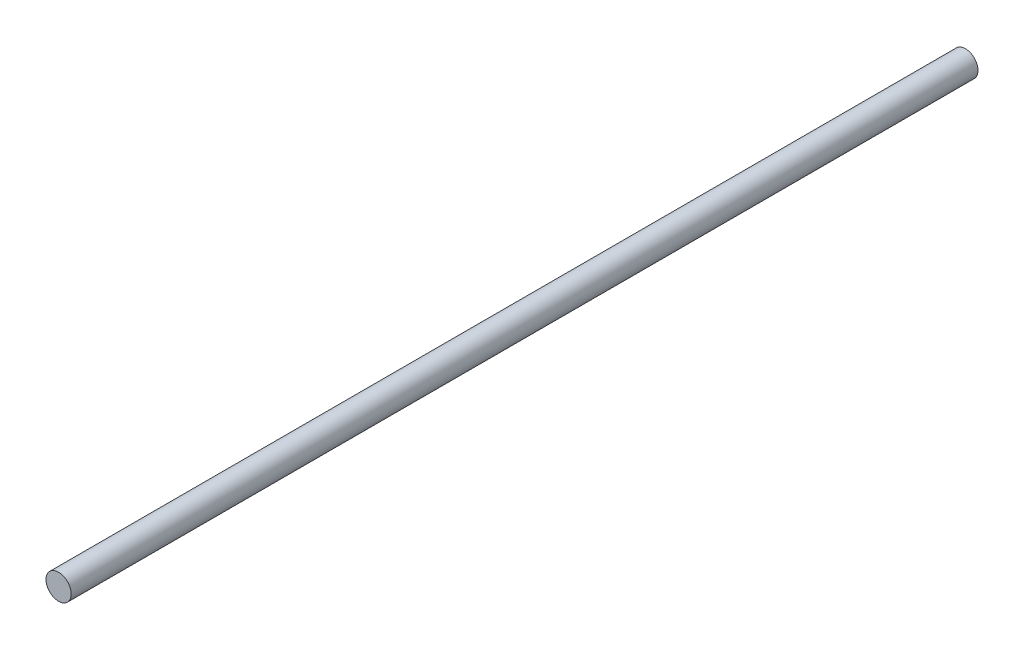
ISO-10303-21;
HEADER;
FILE_DESCRIPTION(('STEP AP214'),'2;1');
FILE_NAME('part.step','',(''),(''),'','','');
FILE_SCHEMA(('AUTOMOTIVE_DESIGN { 1 0 10303 214 1 1 1 1 }'));
ENDSEC;
DATA;
#1=APPLICATION_CONTEXT('core data for automotive mechanical design processes');
#2=APPLICATION_PROTOCOL_DEFINITION('international standard','automotive_design',2000,#1);
#3=PRODUCT_CONTEXT('',#1,'mechanical');
#4=PRODUCT('Part','Part','',(#3));
#5=PRODUCT_RELATED_PRODUCT_CATEGORY('part','',(#4));
#6=PRODUCT_DEFINITION_FORMATION('','',#4);
#7=PRODUCT_DEFINITION_CONTEXT('part definition',#1,'design');
#8=PRODUCT_DEFINITION('design','',#6,#7);
#9=PRODUCT_DEFINITION_SHAPE('','',#8);
#10=(LENGTH_UNIT() NAMED_UNIT(*) SI_UNIT(.MILLI.,.METRE.));
#11=(NAMED_UNIT(*) PLANE_ANGLE_UNIT() SI_UNIT($,.RADIAN.));
#12=(NAMED_UNIT(*) SI_UNIT($,.STERADIAN.) SOLID_ANGLE_UNIT());
#13=UNCERTAINTY_MEASURE_WITH_UNIT(LENGTH_MEASURE(1.E-05),#10,'distance_accuracy_value','');
#14=(GEOMETRIC_REPRESENTATION_CONTEXT(3) GLOBAL_UNCERTAINTY_ASSIGNED_CONTEXT((#13)) GLOBAL_UNIT_ASSIGNED_CONTEXT((#10,
#11,#12)) REPRESENTATION_CONTEXT('',''));
#15=CARTESIAN_POINT('',(0.,0.,0.));
#16=DIRECTION('',(0.,0.,1.));
#17=DIRECTION('',(1.,0.,0.));
#18=AXIS2_PLACEMENT_3D('',#15,#16,#17);
#19=CARTESIAN_POINT('',(0.,0.,-72.));
#20=DIRECTION('',(0.,0.,-1.));
#21=DIRECTION('',(-1.,0.,0.));
#22=AXIS2_PLACEMENT_3D('',#19,#20,#21);
#23=PLANE('',#22);
#24=CARTESIAN_POINT('',(0.,0.,-72.));
#25=DIRECTION('',(0.,0.,1.));
#26=DIRECTION('',(1.,0.,0.));
#27=AXIS2_PLACEMENT_3D('',#24,#25,#26);
#28=CIRCLE('',#27,0.999999999999987);
#29=CARTESIAN_POINT('',(0.999999999999987,0.,-72.));
#30=VERTEX_POINT('',#29);
#31=EDGE_CURVE('E10',#30,#30,#28,.T.);
#32=ORIENTED_EDGE('',*,*,#31,.F.);
#33=EDGE_LOOP('',(#32));
#34=FACE_BOUND('',#33,.T.);
#35=ADVANCED_FACE('F43',(#34),#23,.T.);
#36=CARTESIAN_POINT('',(0.,0.,0.));
#37=DIRECTION('',(0.,0.,1.));
#38=DIRECTION('',(1.,0.,0.));
#39=AXIS2_PLACEMENT_3D('',#36,#37,#38);
#40=CYLINDRICAL_SURFACE('',#39,0.999999999999993);
#41=ORIENTED_EDGE('',*,*,#31,.T.);
#42=EDGE_LOOP('',(#41));
#43=FACE_BOUND('',#42,.T.);
#44=CARTESIAN_POINT('',(0.,0.,0.));
#45=DIRECTION('',(0.,0.,1.));
#46=DIRECTION('',(1.,0.,0.));
#47=AXIS2_PLACEMENT_3D('',#44,#45,#46);
#48=CIRCLE('',#47,0.999999999999999);
#49=CARTESIAN_POINT('',(0.999999999999999,0.,0.));
#50=VERTEX_POINT('',#49);
#51=EDGE_CURVE('E50',#50,#50,#48,.T.);
#52=ORIENTED_EDGE('',*,*,#51,.F.);
#53=EDGE_LOOP('',(#52));
#54=FACE_BOUND('',#53,.T.);
#55=ADVANCED_FACE('F59',(#43,#54),#40,.T.);
#56=CARTESIAN_POINT('',(0.,0.,0.));
#57=DIRECTION('',(0.,0.,1.));
#58=DIRECTION('',(1.,0.,0.));
#59=AXIS2_PLACEMENT_3D('',#56,#57,#58);
#60=PLANE('',#59);
#61=ORIENTED_EDGE('',*,*,#51,.T.);
#62=EDGE_LOOP('',(#61));
#63=FACE_BOUND('',#62,.T.);
#64=ADVANCED_FACE('F57',(#63),#60,.T.);
#65=CLOSED_SHELL('',(#35,#55,#64));
#66=MANIFOLD_SOLID_BREP('B2',#65);
#67=ADVANCED_BREP_SHAPE_REPRESENTATION('',(#18,#66),#14);
#68=SHAPE_DEFINITION_REPRESENTATION(#9,#67);
ENDSEC;
END-ISO-10303-21;
